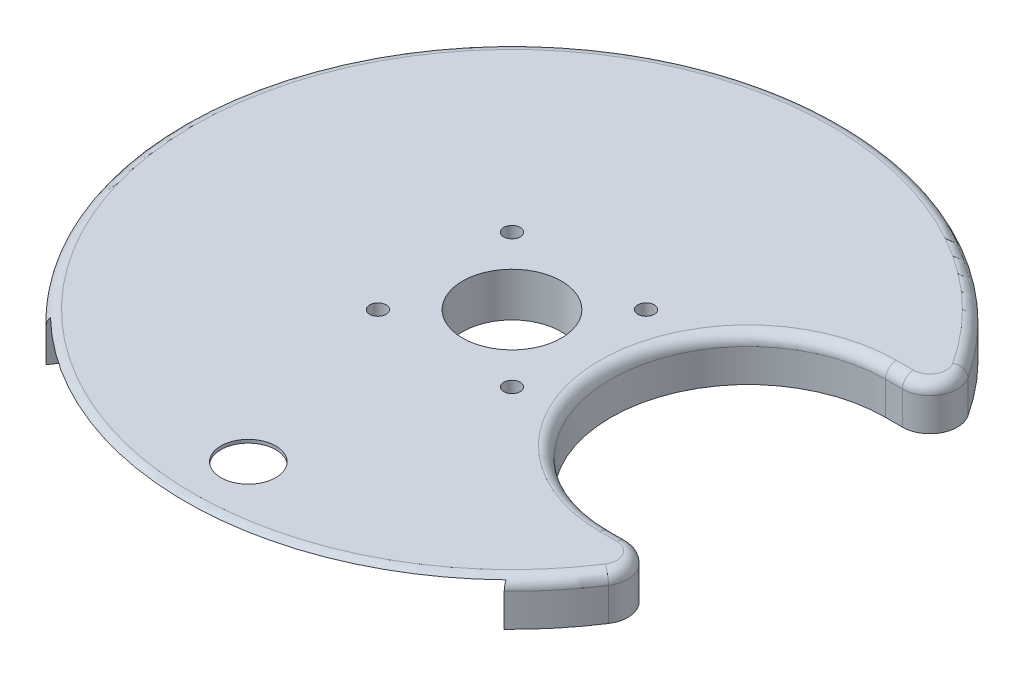
ISO-10303-21;
HEADER;
FILE_DESCRIPTION(('STEP AP214'),'2;1');
FILE_NAME('part.step','',(''),(''),'','','');
FILE_SCHEMA(('AUTOMOTIVE_DESIGN { 1 0 10303 214 1 1 1 1 }'));
ENDSEC;
DATA;
#1=APPLICATION_CONTEXT('core data for automotive mechanical design processes');
#2=APPLICATION_PROTOCOL_DEFINITION('international standard','automotive_design',2000,#1);
#3=PRODUCT_CONTEXT('',#1,'mechanical');
#4=PRODUCT('Part','Part','',(#3));
#5=PRODUCT_RELATED_PRODUCT_CATEGORY('part','',(#4));
#6=PRODUCT_DEFINITION_FORMATION('','',#4);
#7=PRODUCT_DEFINITION_CONTEXT('part definition',#1,'design');
#8=PRODUCT_DEFINITION('design','',#6,#7);
#9=PRODUCT_DEFINITION_SHAPE('','',#8);
#10=(LENGTH_UNIT() NAMED_UNIT(*) SI_UNIT(.MILLI.,.METRE.));
#11=(NAMED_UNIT(*) PLANE_ANGLE_UNIT() SI_UNIT($,.RADIAN.));
#12=(NAMED_UNIT(*) SI_UNIT($,.STERADIAN.) SOLID_ANGLE_UNIT());
#13=UNCERTAINTY_MEASURE_WITH_UNIT(LENGTH_MEASURE(1.E-05),#10,'distance_accuracy_value','');
#14=(GEOMETRIC_REPRESENTATION_CONTEXT(3) GLOBAL_UNCERTAINTY_ASSIGNED_CONTEXT((#13)) GLOBAL_UNIT_ASSIGNED_CONTEXT((#10,
#11,#12)) REPRESENTATION_CONTEXT('',''));
#15=CARTESIAN_POINT('',(0.,0.,0.));
#16=DIRECTION('',(0.,0.,1.));
#17=DIRECTION('',(1.,0.,0.));
#18=AXIS2_PLACEMENT_3D('',#15,#16,#17);
#19=CARTESIAN_POINT('',(0.,10.16,0.));
#20=DIRECTION('',(0.,-1.,0.));
#21=DIRECTION('',(0.,0.,-1.));
#22=AXIS2_PLACEMENT_3D('',#19,#20,#21);
#23=CYLINDRICAL_SURFACE('',#22,76.2);
#24=DIRECTION('',(0.,-1.,0.));
#25=VECTOR('',#24,1.);
#26=CARTESIAN_POINT('',(63.8662988768835,10.16,41.5636363636364));
#27=LINE('',#26,#25);
#28=CARTESIAN_POINT('',(63.8662988768835,0.,41.5636363636364));
#29=VERTEX_POINT('',#28);
#30=CARTESIAN_POINT('',(63.8662988768835,7.62,41.5636363636364));
#31=VERTEX_POINT('',#30);
#32=EDGE_CURVE('E300',#29,#31,#27,.F.);
#33=ORIENTED_EDGE('',*,*,#32,.T.);
#34=CARTESIAN_POINT('',(0.,7.62,0.));
#35=DIRECTION('',(0.,1.,0.));
#36=DIRECTION('',(0.,0.,1.));
#37=AXIS2_PLACEMENT_3D('',#34,#35,#36);
#38=CIRCLE('',#37,76.2);
#39=CARTESIAN_POINT('',(52.9794679421894,7.62,54.7687500000002));
#40=VERTEX_POINT('',#39);
#41=EDGE_CURVE('E337',#31,#40,#38,.F.);
#42=ORIENTED_EDGE('',*,*,#41,.T.);
#43=DIRECTION('',(0.,-1.,0.));
#44=VECTOR('',#43,1.);
#45=CARTESIAN_POINT('',(52.9794679421894,9.398,54.7687500000002));
#46=LINE('',#45,#44);
#47=CARTESIAN_POINT('',(52.9794679421894,0.,54.7687500000002));
#48=VERTEX_POINT('',#47);
#49=EDGE_CURVE('E181',#40,#48,#46,.T.);
#50=ORIENTED_EDGE('',*,*,#49,.T.);
#51=CARTESIAN_POINT('',(0.,0.,0.));
#52=DIRECTION('',(0.,1.,0.));
#53=DIRECTION('',(0.,0.,1.));
#54=AXIS2_PLACEMENT_3D('',#51,#52,#53);
#55=CIRCLE('',#54,76.2);
#56=EDGE_CURVE('E234',#48,#29,#55,.T.);
#57=ORIENTED_EDGE('',*,*,#56,.T.);
#58=EDGE_LOOP('',(#33,#42,#50,#57));
#59=FACE_BOUND('',#58,.T.);
#60=ADVANCED_FACE('F73',(#59),#23,.T.);
#61=CARTESIAN_POINT('',(0.,0.,0.));
#62=DIRECTION('',(0.,1.,0.));
#63=DIRECTION('',(0.,0.,1.));
#64=AXIS2_PLACEMENT_3D('',#61,#62,#63);
#65=PLANE('',#64);
#66=CARTESIAN_POINT('',(-15.499999988,0.,15.499999988));
#67=DIRECTION('',(0.,1.,0.));
#68=DIRECTION('',(0.,0.,1.));
#69=AXIS2_PLACEMENT_3D('',#66,#67,#68);
#70=CIRCLE('',#69,1.905);
#71=CARTESIAN_POINT('',(-15.499999988,0.,17.404999988));
#72=VERTEX_POINT('',#71);
#73=EDGE_CURVE('E219',#72,#72,#70,.T.);
#74=ORIENTED_EDGE('',*,*,#73,.T.);
#75=EDGE_LOOP('',(#74));
#76=FACE_BOUND('',#75,.T.);
#77=CARTESIAN_POINT('',(15.499999988,0.,15.499999988));
#78=DIRECTION('',(0.,1.,0.));
#79=DIRECTION('',(0.,0.,1.));
#80=AXIS2_PLACEMENT_3D('',#77,#78,#79);
#81=CIRCLE('',#80,1.905);
#82=CARTESIAN_POINT('',(15.499999988,0.,17.404999988));
#83=VERTEX_POINT('',#82);
#84=EDGE_CURVE('E226',#83,#83,#81,.T.);
#85=ORIENTED_EDGE('',*,*,#84,.T.);
#86=EDGE_LOOP('',(#85));
#87=FACE_BOUND('',#86,.T.);
#88=CARTESIAN_POINT('',(-15.499999988,0.,-15.499999988));
#89=DIRECTION('',(0.,1.,0.));
#90=DIRECTION('',(0.,0.,1.));
#91=AXIS2_PLACEMENT_3D('',#88,#89,#90);
#92=CIRCLE('',#91,1.905);
#93=CARTESIAN_POINT('',(-15.499999988,0.,-13.594999988));
#94=VERTEX_POINT('',#93);
#95=EDGE_CURVE('E243',#94,#94,#92,.T.);
#96=ORIENTED_EDGE('',*,*,#95,.T.);
#97=EDGE_LOOP('',(#96));
#98=FACE_BOUND('',#97,.T.);
#99=CARTESIAN_POINT('',(15.499999988,0.,-15.499999988));
#100=DIRECTION('',(0.,1.,0.));
#101=DIRECTION('',(0.,0.,1.));
#102=AXIS2_PLACEMENT_3D('',#99,#100,#101);
#103=CIRCLE('',#102,1.905);
#104=CARTESIAN_POINT('',(15.499999988,0.,-13.594999988));
#105=VERTEX_POINT('',#104);
#106=EDGE_CURVE('E276',#105,#105,#103,.T.);
#107=ORIENTED_EDGE('',*,*,#106,.T.);
#108=EDGE_LOOP('',(#107));
#109=FACE_BOUND('',#108,.T.);
#110=CARTESIAN_POINT('',(0.,0.,0.));
#111=DIRECTION('',(0.,1.,0.));
#112=DIRECTION('',(0.,0.,1.));
#113=AXIS2_PLACEMENT_3D('',#110,#111,#112);
#114=CIRCLE('',#113,11.43);
#115=CARTESIAN_POINT('',(0.,0.,11.43));
#116=VERTEX_POINT('',#115);
#117=EDGE_CURVE('E272',#116,#116,#114,.T.);
#118=ORIENTED_EDGE('',*,*,#117,.T.);
#119=EDGE_LOOP('',(#118));
#120=FACE_BOUND('',#119,.T.);
#121=DIRECTION('',(1.,0.,0.));
#122=VECTOR('',#121,1.);
#123=CARTESIAN_POINT('',(0.,0.,31.75));
#124=LINE('',#123,#122);
#125=CARTESIAN_POINT('',(54.61,0.,31.75));
#126=VERTEX_POINT('',#125);
#127=CARTESIAN_POINT('',(58.5441073038099,0.,31.75));
#128=VERTEX_POINT('',#127);
#129=EDGE_CURVE('E260',#126,#128,#124,.T.);
#130=ORIENTED_EDGE('',*,*,#129,.T.);
#131=CARTESIAN_POINT('',(58.5441073038099,0.,38.1));
#132=DIRECTION('',(0.,1.,0.));
#133=DIRECTION('',(0.,0.,1.));
#134=AXIS2_PLACEMENT_3D('',#131,#132,#133);
#135=CIRCLE('',#134,6.35);
#136=EDGE_CURVE('E294',#128,#29,#135,.F.);
#137=ORIENTED_EDGE('',*,*,#136,.T.);
#138=ORIENTED_EDGE('',*,*,#56,.F.);
#139=CARTESIAN_POINT('',(-2.66050878019847E-13,0.,76.2));
#140=DIRECTION('',(0.,-1.,0.));
#141=DIRECTION('',(0.,0.,-1.));
#142=AXIS2_PLACEMENT_3D('',#139,#140,#141);
#143=CIRCLE('',#142,57.15);
#144=CARTESIAN_POINT('',(27.16752859497,0.,25.9203034014576));
#145=VERTEX_POINT('',#144);
#146=EDGE_CURVE('E192',#145,#48,#143,.T.);
#147=ORIENTED_EDGE('',*,*,#146,.F.);
#148=CARTESIAN_POINT('',(27.16752859497,0.,25.9203034014576));
#149=CARTESIAN_POINT('',(-19.35516135307,0.,3.38479493843716));
#150=CARTESIAN_POINT('',(-52.9794679421898,0.,54.7687499999998));
#151=B_SPLINE_CURVE_WITH_KNOTS('',2,(#148,#149,#150),.UNSPECIFIED.,.F.,.F.,(3,3),(0.,1.),.UNSPECIFIED.);
#152=CARTESIAN_POINT('',(-52.9794679421898,0.,54.7687499999998));
#153=VERTEX_POINT('',#152);
#154=EDGE_CURVE('E175',#145,#153,#151,.T.);
#155=ORIENTED_EDGE('',*,*,#154,.T.);
#156=CARTESIAN_POINT('',(63.8662988768835,0.,-41.5636363636364));
#157=VERTEX_POINT('',#156);
#158=EDGE_CURVE('E256',#157,#153,#55,.T.);
#159=ORIENTED_EDGE('',*,*,#158,.F.);
#160=CARTESIAN_POINT('',(58.5441073038099,0.,-38.1));
#161=DIRECTION('',(0.,1.,0.));
#162=DIRECTION('',(0.,0.,1.));
#163=AXIS2_PLACEMENT_3D('',#160,#161,#162);
#164=CIRCLE('',#163,6.35);
#165=CARTESIAN_POINT('',(58.5441073038099,0.,-31.75));
#166=VERTEX_POINT('',#165);
#167=EDGE_CURVE('E291',#157,#166,#164,.F.);
#168=ORIENTED_EDGE('',*,*,#167,.T.);
#169=DIRECTION('',(1.,0.,0.));
#170=VECTOR('',#169,1.);
#171=CARTESIAN_POINT('',(0.,0.,-31.75));
#172=LINE('',#171,#170);
#173=CARTESIAN_POINT('',(54.61,0.,-31.75));
#174=VERTEX_POINT('',#173);
#175=EDGE_CURVE('E268',#174,#166,#172,.T.);
#176=ORIENTED_EDGE('',*,*,#175,.F.);
#177=CARTESIAN_POINT('',(54.61,0.,0.));
#178=DIRECTION('',(0.,1.,0.));
#179=DIRECTION('',(0.,0.,1.));
#180=AXIS2_PLACEMENT_3D('',#177,#178,#179);
#181=CIRCLE('',#180,31.75);
#182=EDGE_CURVE('E264',#174,#126,#181,.T.);
#183=ORIENTED_EDGE('',*,*,#182,.T.);
#184=EDGE_LOOP('',(#130,#137,#138,#147,#155,#159,#168,#176,#183));
#185=FACE_BOUND('',#184,.T.);
#186=ADVANCED_FACE('F413',(#76,#87,#98,#109,#120,#185),#65,.F.);
#187=DIRECTION('',(0.,-1.,0.));
#188=VECTOR('',#187,1.);
#189=CARTESIAN_POINT('',(-52.9794679421898,9.398,54.7687499999998));
#190=LINE('',#189,#188);
#191=CARTESIAN_POINT('',(-52.9794679421898,7.62,54.7687499999998));
#192=VERTEX_POINT('',#191);
#193=EDGE_CURVE('E216',#192,#153,#190,.T.);
#194=ORIENTED_EDGE('',*,*,#193,.F.);
#195=CARTESIAN_POINT('',(0.,7.62,0.));
#196=DIRECTION('',(0.,1.,0.));
#197=DIRECTION('',(0.,0.,1.));
#198=AXIS2_PLACEMENT_3D('',#195,#196,#197);
#199=CIRCLE('',#198,76.2);
#200=CARTESIAN_POINT('',(63.8662988768835,7.62,-41.5636363636364));
#201=VERTEX_POINT('',#200);
#202=EDGE_CURVE('E334',#192,#201,#199,.F.);
#203=ORIENTED_EDGE('',*,*,#202,.T.);
#204=DIRECTION('',(0.,-1.,0.));
#205=VECTOR('',#204,1.);
#206=CARTESIAN_POINT('',(63.8662988768835,10.16,-41.5636363636364));
#207=LINE('',#206,#205);
#208=EDGE_CURVE('E297',#201,#157,#207,.T.);
#209=ORIENTED_EDGE('',*,*,#208,.T.);
#210=ORIENTED_EDGE('',*,*,#158,.T.);
#211=EDGE_LOOP('',(#194,#203,#209,#210));
#212=FACE_BOUND('',#211,.T.);
#213=ADVANCED_FACE('F452',(#212),#23,.T.);
#214=CARTESIAN_POINT('',(0.,10.16,60.96));
#215=DIRECTION('',(0.,-1.,0.));
#216=DIRECTION('',(0.,0.,-1.));
#217=AXIS2_PLACEMENT_3D('',#214,#215,#216);
#218=CYLINDRICAL_SURFACE('',#217,6.35);
#219=CARTESIAN_POINT('',(0.,10.16,60.96));
#220=DIRECTION('',(0.,1.,0.));
#221=DIRECTION('',(0.,0.,1.));
#222=AXIS2_PLACEMENT_3D('',#219,#220,#221);
#223=CIRCLE('',#222,6.35);
#224=CARTESIAN_POINT('',(0.,10.16,67.31));
#225=VERTEX_POINT('',#224);
#226=EDGE_CURVE('E251',#225,#225,#223,.T.);
#227=ORIENTED_EDGE('',*,*,#226,.T.);
#228=EDGE_LOOP('',(#227));
#229=FACE_BOUND('',#228,.T.);
#230=CARTESIAN_POINT('',(0.,9.398,60.96));
#231=DIRECTION('',(0.,-1.,0.));
#232=DIRECTION('',(0.,0.,-1.));
#233=AXIS2_PLACEMENT_3D('',#230,#231,#232);
#234=CIRCLE('',#233,6.35);
#235=CARTESIAN_POINT('',(0.,9.398,54.61));
#236=VERTEX_POINT('',#235);
#237=EDGE_CURVE('E182',#236,#236,#234,.F.);
#238=ORIENTED_EDGE('',*,*,#237,.F.);
#239=EDGE_LOOP('',(#238));
#240=FACE_BOUND('',#239,.T.);
#241=ADVANCED_FACE('F461',(#229,#240),#218,.F.);
#242=CARTESIAN_POINT('',(0.,10.16,0.));
#243=DIRECTION('',(0.,1.,0.));
#244=DIRECTION('',(0.,0.,1.));
#245=AXIS2_PLACEMENT_3D('',#242,#243,#244);
#246=PLANE('',#245);
#247=CARTESIAN_POINT('',(54.61,10.16,0.));
#248=DIRECTION('',(0.,1.,0.));
#249=DIRECTION('',(0.,0.,1.));
#250=AXIS2_PLACEMENT_3D('',#247,#248,#249);
#251=CIRCLE('',#250,34.29);
#252=CARTESIAN_POINT('',(54.61,10.16,34.29));
#253=VERTEX_POINT('',#252);
#254=CARTESIAN_POINT('',(54.61,10.16,-34.29));
#255=VERTEX_POINT('',#254);
#256=EDGE_CURVE('E308',#253,#255,#251,.F.);
#257=ORIENTED_EDGE('',*,*,#256,.T.);
#258=DIRECTION('',(1.,0.,0.));
#259=VECTOR('',#258,1.);
#260=CARTESIAN_POINT('',(58.5441073038099,10.16,-34.29));
#261=LINE('',#260,#259);
#262=CARTESIAN_POINT('',(58.5441073038099,10.16,-34.29));
#263=VERTEX_POINT('',#262);
#264=EDGE_CURVE('E323',#255,#263,#261,.T.);
#265=ORIENTED_EDGE('',*,*,#264,.T.);
#266=CARTESIAN_POINT('',(58.5441073038099,10.16,-38.1));
#267=DIRECTION('',(0.,1.,0.));
#268=DIRECTION('',(0.,0.,1.));
#269=AXIS2_PLACEMENT_3D('',#266,#267,#268);
#270=CIRCLE('',#269,3.81);
#271=CARTESIAN_POINT('',(61.737422247654,10.16,-40.1781818181818));
#272=VERTEX_POINT('',#271);
#273=EDGE_CURVE('E320',#263,#272,#270,.T.);
#274=ORIENTED_EDGE('',*,*,#273,.T.);
#275=CARTESIAN_POINT('',(0.,10.16,0.));
#276=DIRECTION('',(0.,1.,0.));
#277=DIRECTION('',(0.,0.,1.));
#278=AXIS2_PLACEMENT_3D('',#275,#276,#277);
#279=CIRCLE('',#278,73.66);
#280=CARTESIAN_POINT('',(61.737422247654,10.16,40.1781818181818));
#281=VERTEX_POINT('',#280);
#282=EDGE_CURVE('E317',#272,#281,#279,.T.);
#283=ORIENTED_EDGE('',*,*,#282,.T.);
#284=CARTESIAN_POINT('',(58.5441073038099,10.16,38.1));
#285=DIRECTION('',(0.,1.,0.));
#286=DIRECTION('',(0.,0.,1.));
#287=AXIS2_PLACEMENT_3D('',#284,#285,#286);
#288=CIRCLE('',#287,3.81);
#289=CARTESIAN_POINT('',(58.5441073038099,10.16,34.29));
#290=VERTEX_POINT('',#289);
#291=EDGE_CURVE('E314',#281,#290,#288,.T.);
#292=ORIENTED_EDGE('',*,*,#291,.T.);
#293=DIRECTION('',(1.,0.,0.));
#294=VECTOR('',#293,1.);
#295=CARTESIAN_POINT('',(0.,10.16,34.29));
#296=LINE('',#295,#294);
#297=EDGE_CURVE('E311',#290,#253,#296,.F.);
#298=ORIENTED_EDGE('',*,*,#297,.T.);
#299=EDGE_LOOP('',(#257,#265,#274,#283,#292,#298));
#300=FACE_BOUND('',#299,.T.);
#301=CARTESIAN_POINT('',(15.499999988,10.16,15.499999988));
#302=DIRECTION('',(0.,1.,0.));
#303=DIRECTION('',(0.,0.,1.));
#304=AXIS2_PLACEMENT_3D('',#301,#302,#303);
#305=CIRCLE('',#304,1.905);
#306=CARTESIAN_POINT('',(15.499999988,10.16,17.404999988));
#307=VERTEX_POINT('',#306);
#308=EDGE_CURVE('E230',#307,#307,#305,.T.);
#309=ORIENTED_EDGE('',*,*,#308,.F.);
#310=EDGE_LOOP('',(#309));
#311=FACE_BOUND('',#310,.T.);
#312=CARTESIAN_POINT('',(0.,10.16,0.));
#313=DIRECTION('',(0.,1.,0.));
#314=DIRECTION('',(0.,0.,1.));
#315=AXIS2_PLACEMENT_3D('',#312,#313,#314);
#316=CIRCLE('',#315,11.43);
#317=CARTESIAN_POINT('',(0.,10.16,11.43));
#318=VERTEX_POINT('',#317);
#319=EDGE_CURVE('E238',#318,#318,#316,.T.);
#320=ORIENTED_EDGE('',*,*,#319,.F.);
#321=EDGE_LOOP('',(#320));
#322=FACE_BOUND('',#321,.T.);
#323=CARTESIAN_POINT('',(15.499999988,10.16,-15.499999988));
#324=DIRECTION('',(0.,1.,0.));
#325=DIRECTION('',(0.,0.,1.));
#326=AXIS2_PLACEMENT_3D('',#323,#324,#325);
#327=CIRCLE('',#326,1.905);
#328=CARTESIAN_POINT('',(15.499999988,10.16,-13.594999988));
#329=VERTEX_POINT('',#328);
#330=EDGE_CURVE('E242',#329,#329,#327,.T.);
#331=ORIENTED_EDGE('',*,*,#330,.F.);
#332=EDGE_LOOP('',(#331));
#333=FACE_BOUND('',#332,.T.);
#334=CARTESIAN_POINT('',(-15.499999988,10.16,-15.499999988));
#335=DIRECTION('',(0.,1.,0.));
#336=DIRECTION('',(0.,0.,1.));
#337=AXIS2_PLACEMENT_3D('',#334,#335,#336);
#338=CIRCLE('',#337,1.905);
#339=CARTESIAN_POINT('',(-15.499999988,10.16,-13.594999988));
#340=VERTEX_POINT('',#339);
#341=EDGE_CURVE('E247',#340,#340,#338,.T.);
#342=ORIENTED_EDGE('',*,*,#341,.F.);
#343=EDGE_LOOP('',(#342));
#344=FACE_BOUND('',#343,.T.);
#345=ORIENTED_EDGE('',*,*,#226,.F.);
#346=EDGE_LOOP('',(#345));
#347=FACE_BOUND('',#346,.T.);
#348=CARTESIAN_POINT('',(-15.499999988,10.16,15.499999988));
#349=DIRECTION('',(0.,1.,0.));
#350=DIRECTION('',(0.,0.,1.));
#351=AXIS2_PLACEMENT_3D('',#348,#349,#350);
#352=CIRCLE('',#351,1.905);
#353=CARTESIAN_POINT('',(-15.499999988,10.16,17.404999988));
#354=VERTEX_POINT('',#353);
#355=EDGE_CURVE('E222',#354,#354,#352,.T.);
#356=ORIENTED_EDGE('',*,*,#355,.F.);
#357=EDGE_LOOP('',(#356));
#358=FACE_BOUND('',#357,.T.);
#359=ADVANCED_FACE('F439',(#300,#311,#322,#333,#344,#347,#358),#246,.T.);
#360=CARTESIAN_POINT('',(0.,10.16,31.75));
#361=DIRECTION('',(0.,0.,-1.));
#362=DIRECTION('',(-1.,0.,0.));
#363=AXIS2_PLACEMENT_3D('',#360,#361,#362);
#364=PLANE('',#363);
#365=DIRECTION('',(0.,-1.,0.));
#366=VECTOR('',#365,1.);
#367=CARTESIAN_POINT('',(54.61,10.16,31.75));
#368=LINE('',#367,#366);
#369=CARTESIAN_POINT('',(54.61,7.62,31.75));
#370=VERTEX_POINT('',#369);
#371=EDGE_CURVE('E285',#370,#126,#368,.T.);
#372=ORIENTED_EDGE('',*,*,#371,.F.);
#373=DIRECTION('',(1.,0.,0.));
#374=VECTOR('',#373,1.);
#375=CARTESIAN_POINT('',(0.,7.62,31.75));
#376=LINE('',#375,#374);
#377=CARTESIAN_POINT('',(58.5441073038099,7.62,31.75));
#378=VERTEX_POINT('',#377);
#379=EDGE_CURVE('E83',#370,#378,#376,.T.);
#380=ORIENTED_EDGE('',*,*,#379,.T.);
#381=DIRECTION('',(0.,1.,0.));
#382=VECTOR('',#381,1.);
#383=CARTESIAN_POINT('',(58.5441073038099,0.,31.75));
#384=LINE('',#383,#382);
#385=EDGE_CURVE('E288',#378,#128,#384,.F.);
#386=ORIENTED_EDGE('',*,*,#385,.T.);
#387=ORIENTED_EDGE('',*,*,#129,.F.);
#388=EDGE_LOOP('',(#372,#380,#386,#387));
#389=FACE_BOUND('',#388,.T.);
#390=ADVANCED_FACE('F417',(#389),#364,.T.);
#391=CARTESIAN_POINT('',(54.61,10.16,0.));
#392=DIRECTION('',(0.,-1.,0.));
#393=DIRECTION('',(0.,0.,-1.));
#394=AXIS2_PLACEMENT_3D('',#391,#392,#393);
#395=CYLINDRICAL_SURFACE('',#394,31.75);
#396=DIRECTION('',(0.,-1.,0.));
#397=VECTOR('',#396,1.);
#398=CARTESIAN_POINT('',(54.61,10.16,-31.75));
#399=LINE('',#398,#397);
#400=CARTESIAN_POINT('',(54.61,7.62,-31.75));
#401=VERTEX_POINT('',#400);
#402=EDGE_CURVE('E255',#401,#174,#399,.T.);
#403=ORIENTED_EDGE('',*,*,#402,.F.);
#404=CARTESIAN_POINT('',(54.61,7.62,0.));
#405=DIRECTION('',(0.,1.,0.));
#406=DIRECTION('',(0.,0.,1.));
#407=AXIS2_PLACEMENT_3D('',#404,#405,#406);
#408=CIRCLE('',#407,31.75);
#409=EDGE_CURVE('E12',#401,#370,#408,.T.);
#410=ORIENTED_EDGE('',*,*,#409,.T.);
#411=ORIENTED_EDGE('',*,*,#371,.T.);
#412=ORIENTED_EDGE('',*,*,#182,.F.);
#413=EDGE_LOOP('',(#403,#410,#411,#412));
#414=FACE_BOUND('',#413,.T.);
#415=ADVANCED_FACE('F418',(#414),#395,.F.);
#416=CARTESIAN_POINT('',(-15.499999988,10.16,-15.499999988));
#417=DIRECTION('',(0.,-1.,0.));
#418=DIRECTION('',(0.,0.,-1.));
#419=AXIS2_PLACEMENT_3D('',#416,#417,#418);
#420=CYLINDRICAL_SURFACE('',#419,1.905);
#421=ORIENTED_EDGE('',*,*,#341,.T.);
#422=EDGE_LOOP('',(#421));
#423=FACE_BOUND('',#422,.T.);
#424=ORIENTED_EDGE('',*,*,#95,.F.);
#425=EDGE_LOOP('',(#424));
#426=FACE_BOUND('',#425,.T.);
#427=ADVANCED_FACE('F476',(#423,#426),#420,.F.);
#428=CARTESIAN_POINT('',(15.499999988,10.16,-15.499999988));
#429=DIRECTION('',(0.,-1.,0.));
#430=DIRECTION('',(0.,0.,-1.));
#431=AXIS2_PLACEMENT_3D('',#428,#429,#430);
#432=CYLINDRICAL_SURFACE('',#431,1.905);
#433=ORIENTED_EDGE('',*,*,#330,.T.);
#434=EDGE_LOOP('',(#433));
#435=FACE_BOUND('',#434,.T.);
#436=ORIENTED_EDGE('',*,*,#106,.F.);
#437=EDGE_LOOP('',(#436));
#438=FACE_BOUND('',#437,.T.);
#439=ADVANCED_FACE('F479',(#435,#438),#432,.F.);
#440=CARTESIAN_POINT('',(0.,10.16,0.));
#441=DIRECTION('',(0.,-1.,0.));
#442=DIRECTION('',(0.,0.,-1.));
#443=AXIS2_PLACEMENT_3D('',#440,#441,#442);
#444=CYLINDRICAL_SURFACE('',#443,11.43);
#445=ORIENTED_EDGE('',*,*,#319,.T.);
#446=EDGE_LOOP('',(#445));
#447=FACE_BOUND('',#446,.T.);
#448=ORIENTED_EDGE('',*,*,#117,.F.);
#449=EDGE_LOOP('',(#448));
#450=FACE_BOUND('',#449,.T.);
#451=ADVANCED_FACE('F483',(#447,#450),#444,.F.);
#452=CARTESIAN_POINT('',(0.,10.16,-31.75));
#453=DIRECTION('',(0.,0.,-1.));
#454=DIRECTION('',(-1.,0.,0.));
#455=AXIS2_PLACEMENT_3D('',#452,#453,#454);
#456=PLANE('',#455);
#457=DIRECTION('',(0.,-1.,0.));
#458=VECTOR('',#457,1.);
#459=CARTESIAN_POINT('',(58.5441073038099,10.16,-31.75));
#460=LINE('',#459,#458);
#461=CARTESIAN_POINT('',(58.5441073038099,7.62,-31.75));
#462=VERTEX_POINT('',#461);
#463=EDGE_CURVE('E304',#166,#462,#460,.F.);
#464=ORIENTED_EDGE('',*,*,#463,.T.);
#465=DIRECTION('',(1.,0.,0.));
#466=VECTOR('',#465,1.);
#467=CARTESIAN_POINT('',(54.61,7.62,-31.75));
#468=LINE('',#467,#466);
#469=EDGE_CURVE('E327',#462,#401,#468,.F.);
#470=ORIENTED_EDGE('',*,*,#469,.T.);
#471=ORIENTED_EDGE('',*,*,#402,.T.);
#472=ORIENTED_EDGE('',*,*,#175,.T.);
#473=EDGE_LOOP('',(#464,#470,#471,#472));
#474=FACE_BOUND('',#473,.T.);
#475=ADVANCED_FACE('F420',(#474),#456,.F.);
#476=CARTESIAN_POINT('',(15.499999988,10.16,15.499999988));
#477=DIRECTION('',(0.,-1.,0.));
#478=DIRECTION('',(0.,0.,-1.));
#479=AXIS2_PLACEMENT_3D('',#476,#477,#478);
#480=CYLINDRICAL_SURFACE('',#479,1.905);
#481=ORIENTED_EDGE('',*,*,#308,.T.);
#482=EDGE_LOOP('',(#481));
#483=FACE_BOUND('',#482,.T.);
#484=ORIENTED_EDGE('',*,*,#84,.F.);
#485=EDGE_LOOP('',(#484));
#486=FACE_BOUND('',#485,.T.);
#487=ADVANCED_FACE('F490',(#483,#486),#480,.F.);
#488=CARTESIAN_POINT('',(-15.499999988,10.16,15.499999988));
#489=DIRECTION('',(0.,-1.,0.));
#490=DIRECTION('',(0.,0.,-1.));
#491=AXIS2_PLACEMENT_3D('',#488,#489,#490);
#492=CYLINDRICAL_SURFACE('',#491,1.905);
#493=ORIENTED_EDGE('',*,*,#355,.T.);
#494=EDGE_LOOP('',(#493));
#495=FACE_BOUND('',#494,.T.);
#496=ORIENTED_EDGE('',*,*,#73,.F.);
#497=EDGE_LOOP('',(#496));
#498=FACE_BOUND('',#497,.T.);
#499=ADVANCED_FACE('F359',(#495,#498),#492,.F.);
#500=CARTESIAN_POINT('',(27.16752859497,9.398,25.9203034014576));
#501=CARTESIAN_POINT('',(-19.35516135307,9.398,3.38479493843716));
#502=CARTESIAN_POINT('',(-52.9794679421898,9.398,54.7687499999998));
#503=B_SPLINE_CURVE_WITH_KNOTS('',2,(#500,#501,#502),.UNSPECIFIED.,.F.,.F.,(3,3),(0.,1.),.UNSPECIFIED.);
#504=DIRECTION('',(0.,-1.,0.));
#505=VECTOR('',#504,1.);
#506=SURFACE_OF_LINEAR_EXTRUSION('',#503,#505);
#507=CARTESIAN_POINT('',(27.16752859497,9.398,25.9203034014576));
#508=VERTEX_POINT('',#507);
#509=CARTESIAN_POINT('',(-52.5732274267187,9.398,54.1513507117423));
#510=VERTEX_POINT('',#509);
#511=EDGE_CURVE('E172',#508,#510,#503,.T.);
#512=ORIENTED_EDGE('',*,*,#511,.T.);
#513=CARTESIAN_POINT('',(-52.5732274267187,9.398,54.1513507117423));
#514=CARTESIAN_POINT('',(-52.6009362493751,9.34766338882505,54.1932302809141));
#515=CARTESIAN_POINT('',(-52.6274619880012,9.29522858441314,54.2333690475005));
#516=CARTESIAN_POINT('',(-52.6779778119461,9.18652608409439,54.3098846787813));
#517=CARTESIAN_POINT('',(-52.7019677113613,9.13025810767245,54.3462612676645));
#518=CARTESIAN_POINT('',(-52.7472674112843,9.01418555013385,54.4150102667268));
#519=CARTESIAN_POINT('',(-52.7685737205698,8.95437650788743,54.4473774599885));
#520=CARTESIAN_POINT('',(-52.8083134035599,8.83172605165884,54.5077930291139));
#521=CARTESIAN_POINT('',(-52.8267469893304,8.76888486196044,54.53584172377));
#522=CARTESIAN_POINT('',(-52.8775677793119,8.57630989098299,54.613219233632));
#523=CARTESIAN_POINT('',(-52.9054642130353,8.44255242916359,54.6557630592674));
#524=CARTESIAN_POINT('',(-52.9483028564083,8.16861832942658,54.7211346424735));
#525=CARTESIAN_POINT('',(-52.9632751610031,8.02845740897299,54.7440082034755));
#526=CARTESIAN_POINT('',(-52.9742310485922,7.84277904305845,54.760747616113));
#527=CARTESIAN_POINT('',(-52.9761953528162,7.79827235820728,54.7637491079049));
#528=CARTESIAN_POINT('',(-52.9788124529381,7.70918289860315,54.7677482450688));
#529=CARTESIAN_POINT('',(-52.9794667847371,7.66460027436992,54.7687482371353));
#530=CARTESIAN_POINT('',(-52.9794679421898,7.62,54.7687499999998));
#531=B_SPLINE_CURVE_WITH_KNOTS('',3,(#513,#514,#515,#516,#517,#518,#519,#520,#521,#522,#523,
#524,#525,#526,#527,#528,#529,#530),.UNSPECIFIED.,.F.,.F.,(4,2,2,2,2,2,2,2,4),(0.,
0.213241244174735,0.426498110341117,0.640029609118632,0.853545337405176,1.28067742305715,
1.70681219094195,1.84071883460709,1.97446838482877),.UNSPECIFIED.);
#532=EDGE_CURVE('E361',#510,#192,#531,.T.);
#533=ORIENTED_EDGE('',*,*,#532,.T.);
#534=ORIENTED_EDGE('',*,*,#193,.T.);
#535=ORIENTED_EDGE('',*,*,#154,.F.);
#536=DIRECTION('',(0.,-1.,0.));
#537=VECTOR('',#536,1.);
#538=CARTESIAN_POINT('',(27.16752859497,9.398,25.9203034014576));
#539=LINE('',#538,#537);
#540=EDGE_CURVE('E169',#508,#145,#539,.T.);
#541=ORIENTED_EDGE('',*,*,#540,.F.);
#542=EDGE_LOOP('',(#512,#533,#534,#535,#541));
#543=FACE_BOUND('',#542,.T.);
#544=ADVANCED_FACE('F171',(#543),#506,.T.);
#545=CARTESIAN_POINT('',(-2.66050878019847E-13,9.398,76.2));
#546=DIRECTION('',(0.,-1.,0.));
#547=DIRECTION('',(0.,0.,-1.));
#548=AXIS2_PLACEMENT_3D('',#545,#546,#547);
#549=CYLINDRICAL_SURFACE('',#548,57.15);
#550=ORIENTED_EDGE('',*,*,#49,.F.);
#551=CARTESIAN_POINT('',(52.9794679421895,7.62,54.7687500000002));
#552=CARTESIAN_POINT('',(52.9794710045749,7.687763316069,54.7687600568037));
#553=CARTESIAN_POINT('',(52.9783710627089,7.75552170229907,54.7660385019183));
#554=CARTESIAN_POINT('',(52.9739888031184,7.89052354763471,54.7552087308425));
#555=CARTESIAN_POINT('',(52.9707068859604,7.9577670989621,54.747101503353));
#556=CARTESIAN_POINT('',(52.9619942311,8.09110733831467,54.7256014226836));
#557=CARTESIAN_POINT('',(52.9565684072456,8.15720629064933,54.7122206566677));
#558=CARTESIAN_POINT('',(52.9436175519915,8.28792699325082,54.6803309907209));
#559=CARTESIAN_POINT('',(52.9360925369066,8.35254875499406,54.6618221306452));
#560=CARTESIAN_POINT('',(52.9104541905473,8.54350352865828,54.5988792252069));
#561=CARTESIAN_POINT('',(52.8892685107041,8.66706317498308,54.5470063603641));
#562=CARTESIAN_POINT('',(52.839355154212,8.90332440841348,54.4254892448473));
#563=CARTESIAN_POINT('',(52.8106308187271,9.01603077556482,54.3558528674198));
#564=CARTESIAN_POINT('',(52.7637263566576,9.17104089015804,54.2429242356041));
#565=CARTESIAN_POINT('',(52.7481805989952,9.21861638053056,54.2055981326968));
#566=CARTESIAN_POINT('',(52.7157642486763,9.3106495501228,54.1280162962466));
#567=CARTESIAN_POINT('',(52.6988965932051,9.35511374814617,54.0877670715411));
#568=CARTESIAN_POINT('',(52.6813879401814,9.39800000000017,54.0461320601553));
#569=B_SPLINE_CURVE_WITH_KNOTS('',3,(#551,#552,#553,#554,#555,#556,#557,#558,#559,#560,#561,
#562,#563,#564,#565,#566,#567,#568),.UNSPECIFIED.,.F.,.F.,(4,2,2,2,2,2,2,2,4),(0.,
0.203218011394659,0.406398726364933,0.609116426252754,0.811832550672865,1.21685231617779,
1.62169287745676,1.80886712305582,1.99563666737925),.UNSPECIFIED.);
#570=CARTESIAN_POINT('',(52.6813879401813,9.398,54.0461320601551));
#571=VERTEX_POINT('',#570);
#572=EDGE_CURVE('E197',#40,#571,#569,.T.);
#573=ORIENTED_EDGE('',*,*,#572,.T.);
#574=CARTESIAN_POINT('',(-2.66050878019847E-13,9.398,76.2));
#575=DIRECTION('',(0.,-1.,0.));
#576=DIRECTION('',(0.,0.,-1.));
#577=AXIS2_PLACEMENT_3D('',#574,#575,#576);
#578=CIRCLE('',#577,57.15);
#579=EDGE_CURVE('E188',#508,#571,#578,.T.);
#580=ORIENTED_EDGE('',*,*,#579,.F.);
#581=ORIENTED_EDGE('',*,*,#540,.T.);
#582=ORIENTED_EDGE('',*,*,#146,.T.);
#583=EDGE_LOOP('',(#550,#573,#580,#581,#582));
#584=FACE_BOUND('',#583,.T.);
#585=ADVANCED_FACE('F195',(#584),#549,.F.);
#586=CARTESIAN_POINT('',(0.,9.398,0.));
#587=DIRECTION('',(0.,-1.,0.));
#588=DIRECTION('',(0.,0.,-1.));
#589=AXIS2_PLACEMENT_3D('',#586,#587,#588);
#590=PLANE('',#589);
#591=ORIENTED_EDGE('',*,*,#579,.T.);
#592=CARTESIAN_POINT('',(0.,9.398,0.));
#593=DIRECTION('',(0.,1.,0.));
#594=DIRECTION('',(0.,0.,1.));
#595=AXIS2_PLACEMENT_3D('',#592,#593,#594);
#596=CIRCLE('',#595,75.4739228208499);
#597=EDGE_CURVE('E190',#571,#510,#596,.F.);
#598=ORIENTED_EDGE('',*,*,#597,.T.);
#599=ORIENTED_EDGE('',*,*,#511,.F.);
#600=EDGE_LOOP('',(#591,#598,#599));
#601=FACE_BOUND('',#600,.T.);
#602=ORIENTED_EDGE('',*,*,#237,.T.);
#603=EDGE_LOOP('',(#602));
#604=FACE_BOUND('',#603,.T.);
#605=ADVANCED_FACE('F186',(#601,#604),#590,.T.);
#606=CARTESIAN_POINT('',(58.5441073038099,10.16,38.1));
#607=DIRECTION('',(0.,-1.,0.));
#608=DIRECTION('',(0.,0.,-1.));
#609=AXIS2_PLACEMENT_3D('',#606,#607,#608);
#610=CYLINDRICAL_SURFACE('',#609,6.35);
#611=ORIENTED_EDGE('',*,*,#385,.F.);
#612=CARTESIAN_POINT('',(58.5441073038099,7.62,38.1));
#613=DIRECTION('',(0.,1.,0.));
#614=DIRECTION('',(0.,0.,1.));
#615=AXIS2_PLACEMENT_3D('',#612,#613,#614);
#616=CIRCLE('',#615,6.35);
#617=EDGE_CURVE('E368',#378,#31,#616,.F.);
#618=ORIENTED_EDGE('',*,*,#617,.T.);
#619=ORIENTED_EDGE('',*,*,#32,.F.);
#620=ORIENTED_EDGE('',*,*,#136,.F.);
#621=EDGE_LOOP('',(#611,#618,#619,#620));
#622=FACE_BOUND('',#621,.T.);
#623=ADVANCED_FACE('F405',(#622),#610,.T.);
#624=CARTESIAN_POINT('',(58.5441073038099,10.16,-38.1));
#625=DIRECTION('',(0.,-1.,0.));
#626=DIRECTION('',(0.,0.,-1.));
#627=AXIS2_PLACEMENT_3D('',#624,#625,#626);
#628=CYLINDRICAL_SURFACE('',#627,6.35);
#629=ORIENTED_EDGE('',*,*,#208,.F.);
#630=CARTESIAN_POINT('',(58.5441073038099,7.62,-38.1));
#631=DIRECTION('',(0.,1.,0.));
#632=DIRECTION('',(0.,0.,1.));
#633=AXIS2_PLACEMENT_3D('',#630,#631,#632);
#634=CIRCLE('',#633,6.35);
#635=EDGE_CURVE('E331',#201,#462,#634,.F.);
#636=ORIENTED_EDGE('',*,*,#635,.T.);
#637=ORIENTED_EDGE('',*,*,#463,.F.);
#638=ORIENTED_EDGE('',*,*,#167,.F.);
#639=EDGE_LOOP('',(#629,#636,#637,#638));
#640=FACE_BOUND('',#639,.T.);
#641=ADVANCED_FACE('F427',(#640),#628,.T.);
#642=CARTESIAN_POINT('',(58.5441073038099,7.62,38.1));
#643=DIRECTION('',(0.,1.,0.));
#644=DIRECTION('',(0.,0.,1.));
#645=AXIS2_PLACEMENT_3D('',#642,#643,#644);
#646=TOROIDAL_SURFACE('',#645,3.81,2.54);
#647=CARTESIAN_POINT('',(61.737422247654,7.62,40.1781818181818));
#648=DIRECTION('',(-0.545454545454545,0.,0.838140405208444));
#649=DIRECTION('',(0.838140405208445,0.,0.545454545454545));
#650=AXIS2_PLACEMENT_3D('',#647,#648,#649);
#651=CIRCLE('',#650,2.54);
#652=EDGE_CURVE('E386',#31,#281,#651,.T.);
#653=ORIENTED_EDGE('',*,*,#652,.F.);
#654=ORIENTED_EDGE('',*,*,#617,.F.);
#655=CARTESIAN_POINT('',(58.5441073038099,7.62,34.29));
#656=DIRECTION('',(-1.,0.,0.));
#657=DIRECTION('',(0.,0.,1.));
#658=AXIS2_PLACEMENT_3D('',#655,#656,#657);
#659=CIRCLE('',#658,2.54);
#660=EDGE_CURVE('E77',#290,#378,#659,.T.);
#661=ORIENTED_EDGE('',*,*,#660,.F.);
#662=ORIENTED_EDGE('',*,*,#291,.F.);
#663=EDGE_LOOP('',(#653,#654,#661,#662));
#664=FACE_BOUND('',#663,.T.);
#665=ADVANCED_FACE('F75',(#664),#646,.T.);
#666=CARTESIAN_POINT('',(0.,7.62,34.29));
#667=DIRECTION('',(1.,0.,0.));
#668=DIRECTION('',(0.,0.,-1.));
#669=AXIS2_PLACEMENT_3D('',#666,#667,#668);
#670=CYLINDRICAL_SURFACE('',#669,2.54);
#671=ORIENTED_EDGE('',*,*,#660,.T.);
#672=ORIENTED_EDGE('',*,*,#379,.F.);
#673=CARTESIAN_POINT('',(54.61,7.62,34.29));
#674=DIRECTION('',(-1.,0.,0.));
#675=DIRECTION('',(0.,0.,1.));
#676=AXIS2_PLACEMENT_3D('',#673,#674,#675);
#677=CIRCLE('',#676,2.54);
#678=EDGE_CURVE('E383',#253,#370,#677,.T.);
#679=ORIENTED_EDGE('',*,*,#678,.F.);
#680=ORIENTED_EDGE('',*,*,#297,.F.);
#681=EDGE_LOOP('',(#671,#672,#679,#680));
#682=FACE_BOUND('',#681,.T.);
#683=ADVANCED_FACE('F398',(#682),#670,.T.);
#684=CARTESIAN_POINT('',(0.,7.62,0.));
#685=DIRECTION('',(0.,1.,0.));
#686=DIRECTION('',(0.,0.,1.));
#687=AXIS2_PLACEMENT_3D('',#684,#685,#686);
#688=TOROIDAL_SURFACE('',#687,73.66,2.54);
#689=ORIENTED_EDGE('',*,*,#652,.T.);
#690=ORIENTED_EDGE('',*,*,#282,.F.);
#691=CARTESIAN_POINT('',(61.737422247654,7.62,-40.1781818181818));
#692=DIRECTION('',(0.545454545454545,0.,0.838140405208444));
#693=DIRECTION('',(0.838140405208445,0.,-0.545454545454545));
#694=AXIS2_PLACEMENT_3D('',#691,#692,#693);
#695=CIRCLE('',#694,2.54);
#696=EDGE_CURVE('E379',#201,#272,#695,.T.);
#697=ORIENTED_EDGE('',*,*,#696,.F.);
#698=ORIENTED_EDGE('',*,*,#202,.F.);
#699=ORIENTED_EDGE('',*,*,#532,.F.);
#700=ORIENTED_EDGE('',*,*,#597,.F.);
#701=ORIENTED_EDGE('',*,*,#572,.F.);
#702=ORIENTED_EDGE('',*,*,#41,.F.);
#703=EDGE_LOOP('',(#689,#690,#697,#698,#699,#700,#701,#702));
#704=FACE_BOUND('',#703,.T.);
#705=ADVANCED_FACE('F349',(#704),#688,.T.);
#706=CARTESIAN_POINT('',(54.61,7.62,0.));
#707=DIRECTION('',(0.,1.,0.));
#708=DIRECTION('',(0.,0.,1.));
#709=AXIS2_PLACEMENT_3D('',#706,#707,#708);
#710=TOROIDAL_SURFACE('',#709,34.29,2.54);
#711=ORIENTED_EDGE('',*,*,#678,.T.);
#712=ORIENTED_EDGE('',*,*,#409,.F.);
#713=CARTESIAN_POINT('',(54.61,7.62,-34.29));
#714=DIRECTION('',(1.,0.,0.));
#715=DIRECTION('',(0.,0.,-1.));
#716=AXIS2_PLACEMENT_3D('',#713,#714,#715);
#717=CIRCLE('',#716,2.54);
#718=EDGE_CURVE('E376',#255,#401,#717,.T.);
#719=ORIENTED_EDGE('',*,*,#718,.F.);
#720=ORIENTED_EDGE('',*,*,#256,.F.);
#721=EDGE_LOOP('',(#711,#712,#719,#720));
#722=FACE_BOUND('',#721,.T.);
#723=ADVANCED_FACE('F443',(#722),#710,.T.);
#724=CARTESIAN_POINT('',(58.5441073038099,7.62,-38.1));
#725=DIRECTION('',(0.,1.,0.));
#726=DIRECTION('',(0.,0.,1.));
#727=AXIS2_PLACEMENT_3D('',#724,#725,#726);
#728=TOROIDAL_SURFACE('',#727,3.81,2.54);
#729=ORIENTED_EDGE('',*,*,#696,.T.);
#730=ORIENTED_EDGE('',*,*,#273,.F.);
#731=CARTESIAN_POINT('',(58.5441073038099,7.62,-34.29));
#732=DIRECTION('',(-1.,0.,0.));
#733=DIRECTION('',(0.,0.,1.));
#734=AXIS2_PLACEMENT_3D('',#731,#732,#733);
#735=CIRCLE('',#734,2.54);
#736=EDGE_CURVE('E373',#462,#263,#735,.T.);
#737=ORIENTED_EDGE('',*,*,#736,.F.);
#738=ORIENTED_EDGE('',*,*,#635,.F.);
#739=EDGE_LOOP('',(#729,#730,#737,#738));
#740=FACE_BOUND('',#739,.T.);
#741=ADVANCED_FACE('F437',(#740),#728,.T.);
#742=CARTESIAN_POINT('',(0.,7.62,-34.29));
#743=DIRECTION('',(-1.,0.,0.));
#744=DIRECTION('',(0.,0.,1.));
#745=AXIS2_PLACEMENT_3D('',#742,#743,#744);
#746=CYLINDRICAL_SURFACE('',#745,2.54);
#747=ORIENTED_EDGE('',*,*,#718,.T.);
#748=ORIENTED_EDGE('',*,*,#469,.F.);
#749=ORIENTED_EDGE('',*,*,#736,.T.);
#750=ORIENTED_EDGE('',*,*,#264,.F.);
#751=EDGE_LOOP('',(#747,#748,#749,#750));
#752=FACE_BOUND('',#751,.T.);
#753=ADVANCED_FACE('F432',(#752),#746,.T.);
#754=CLOSED_SHELL('',(#60,#186,#213,#241,#359,#390,#415,#427,#439,#451,#475,#487,#499,#544,#585,
#605,#623,#641,#665,#683,#705,#723,#741,#753));
#755=MANIFOLD_SOLID_BREP('B2',#754);
#756=ADVANCED_BREP_SHAPE_REPRESENTATION('',(#18,#755),#14);
#757=SHAPE_DEFINITION_REPRESENTATION(#9,#756);
ENDSEC;
END-ISO-10303-21;
